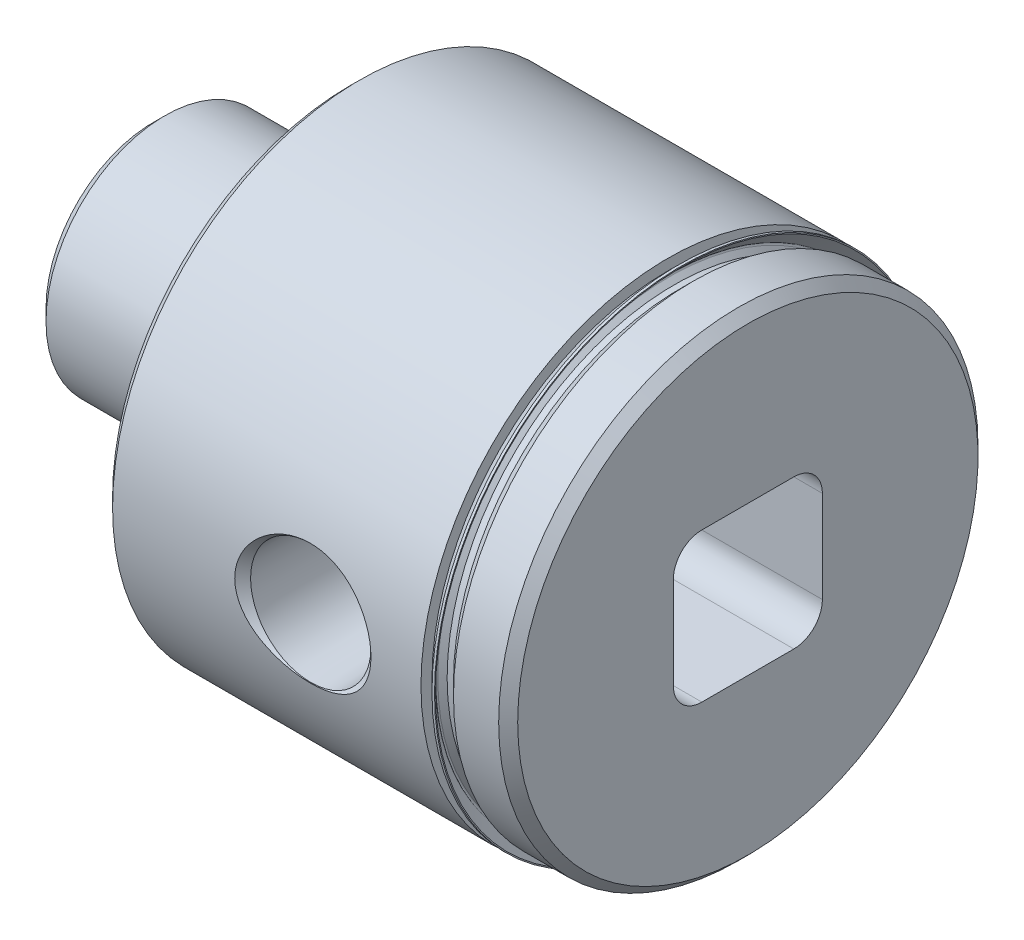
ISO-10303-21;
HEADER;
FILE_DESCRIPTION(('STEP AP214'),'2;1');
FILE_NAME('part.step','',(''),(''),'','','');
FILE_SCHEMA(('AUTOMOTIVE_DESIGN { 1 0 10303 214 1 1 1 1 }'));
ENDSEC;
DATA;
#1=APPLICATION_CONTEXT('core data for automotive mechanical design processes');
#2=APPLICATION_PROTOCOL_DEFINITION('international standard','automotive_design',2000,#1);
#3=PRODUCT_CONTEXT('',#1,'mechanical');
#4=PRODUCT('Part','Part','',(#3));
#5=PRODUCT_RELATED_PRODUCT_CATEGORY('part','',(#4));
#6=PRODUCT_DEFINITION_FORMATION('','',#4);
#7=PRODUCT_DEFINITION_CONTEXT('part definition',#1,'design');
#8=PRODUCT_DEFINITION('design','',#6,#7);
#9=PRODUCT_DEFINITION_SHAPE('','',#8);
#10=(LENGTH_UNIT() NAMED_UNIT(*) SI_UNIT(.MILLI.,.METRE.));
#11=(NAMED_UNIT(*) PLANE_ANGLE_UNIT() SI_UNIT($,.RADIAN.));
#12=(NAMED_UNIT(*) SI_UNIT($,.STERADIAN.) SOLID_ANGLE_UNIT());
#13=UNCERTAINTY_MEASURE_WITH_UNIT(LENGTH_MEASURE(1.E-05),#10,'distance_accuracy_value','');
#14=(GEOMETRIC_REPRESENTATION_CONTEXT(3) GLOBAL_UNCERTAINTY_ASSIGNED_CONTEXT((#13)) GLOBAL_UNIT_ASSIGNED_CONTEXT((#10,
#11,#12)) REPRESENTATION_CONTEXT('',''));
#15=CARTESIAN_POINT('',(0.,0.,0.));
#16=DIRECTION('',(0.,0.,1.));
#17=DIRECTION('',(1.,0.,0.));
#18=AXIS2_PLACEMENT_3D('',#15,#16,#17);
#19=CARTESIAN_POINT('',(0.,0.,0.));
#20=DIRECTION('',(1.,0.,0.));
#21=DIRECTION('',(0.,0.,-1.));
#22=AXIS2_PLACEMENT_3D('',#19,#20,#21);
#23=PLANE('',#22);
#24=CARTESIAN_POINT('',(0.,0.,0.));
#25=DIRECTION('',(-1.,0.,0.));
#26=DIRECTION('',(0.,0.,1.));
#27=AXIS2_PLACEMENT_3D('',#24,#25,#26);
#28=CIRCLE('',#27,8.58901);
#29=CARTESIAN_POINT('',(0.,0.,8.58901));
#30=VERTEX_POINT('',#29);
#31=EDGE_CURVE('E201',#30,#30,#28,.T.);
#32=ORIENTED_EDGE('',*,*,#31,.T.);
#33=EDGE_LOOP('',(#32));
#34=FACE_BOUND('',#33,.T.);
#35=CARTESIAN_POINT('',(0.,3.68299999999984,3.68299999999984));
#36=DIRECTION('',(1.,0.,0.));
#37=DIRECTION('',(0.,0.,-1.));
#38=AXIS2_PLACEMENT_3D('',#35,#36,#37);
#39=CIRCLE('',#38,2.28600000000016);
#40=CARTESIAN_POINT('',(0.,5.969,3.683));
#41=VERTEX_POINT('',#40);
#42=CARTESIAN_POINT('',(0.,3.683,5.969));
#43=VERTEX_POINT('',#42);
#44=EDGE_CURVE('E55',#41,#43,#39,.T.);
#45=ORIENTED_EDGE('',*,*,#44,.T.);
#46=DIRECTION('',(0.,-1.,0.));
#47=VECTOR('',#46,1.);
#48=CARTESIAN_POINT('',(0.,3.683,5.969));
#49=LINE('',#48,#47);
#50=CARTESIAN_POINT('',(0.,-3.683,5.969));
#51=VERTEX_POINT('',#50);
#52=EDGE_CURVE('E113',#43,#51,#49,.T.);
#53=ORIENTED_EDGE('',*,*,#52,.T.);
#54=CARTESIAN_POINT('',(0.,-3.68299999999984,3.68299999999984));
#55=DIRECTION('',(1.,0.,0.));
#56=DIRECTION('',(0.,0.,-1.));
#57=AXIS2_PLACEMENT_3D('',#54,#55,#56);
#58=CIRCLE('',#57,2.28600000000016);
#59=CARTESIAN_POINT('',(0.,-5.969,3.683));
#60=VERTEX_POINT('',#59);
#61=EDGE_CURVE('E119',#51,#60,#58,.T.);
#62=ORIENTED_EDGE('',*,*,#61,.T.);
#63=DIRECTION('',(0.,0.,-1.));
#64=VECTOR('',#63,1.);
#65=CARTESIAN_POINT('',(0.,-5.969,3.683));
#66=LINE('',#65,#64);
#67=CARTESIAN_POINT('',(0.,-5.969,-3.683));
#68=VERTEX_POINT('',#67);
#69=EDGE_CURVE('E127',#60,#68,#66,.T.);
#70=ORIENTED_EDGE('',*,*,#69,.T.);
#71=CARTESIAN_POINT('',(0.,-3.68299999999984,-3.68299999999984));
#72=DIRECTION('',(1.,0.,0.));
#73=DIRECTION('',(0.,0.,-1.));
#74=AXIS2_PLACEMENT_3D('',#71,#72,#73);
#75=CIRCLE('',#74,2.28600000000016);
#76=CARTESIAN_POINT('',(0.,-3.683,-5.969));
#77=VERTEX_POINT('',#76);
#78=EDGE_CURVE('E130',#68,#77,#75,.T.);
#79=ORIENTED_EDGE('',*,*,#78,.T.);
#80=DIRECTION('',(0.,1.,0.));
#81=VECTOR('',#80,1.);
#82=CARTESIAN_POINT('',(0.,-3.683,-5.969));
#83=LINE('',#82,#81);
#84=CARTESIAN_POINT('',(0.,3.683,-5.969));
#85=VERTEX_POINT('',#84);
#86=EDGE_CURVE('E133',#77,#85,#83,.T.);
#87=ORIENTED_EDGE('',*,*,#86,.T.);
#88=CARTESIAN_POINT('',(0.,3.68299999999984,-3.68299999999984));
#89=DIRECTION('',(1.,0.,0.));
#90=DIRECTION('',(0.,0.,-1.));
#91=AXIS2_PLACEMENT_3D('',#88,#89,#90);
#92=CIRCLE('',#91,2.28600000000016);
#93=CARTESIAN_POINT('',(0.,5.969,-3.683));
#94=VERTEX_POINT('',#93);
#95=EDGE_CURVE('E136',#85,#94,#92,.T.);
#96=ORIENTED_EDGE('',*,*,#95,.T.);
#97=DIRECTION('',(0.,0.,1.));
#98=VECTOR('',#97,1.);
#99=CARTESIAN_POINT('',(0.,5.969,-3.683));
#100=LINE('',#99,#98);
#101=EDGE_CURVE('E123',#94,#41,#100,.T.);
#102=ORIENTED_EDGE('',*,*,#101,.T.);
#103=EDGE_LOOP('',(#45,#53,#62,#70,#79,#87,#96,#102));
#104=FACE_BOUND('',#103,.T.);
#105=ADVANCED_FACE('F40',(#34,#104),#23,.F.);
#106=CARTESIAN_POINT('',(31.75,0.,19.76755));
#107=DIRECTION('',(0.,0.,-1.));
#108=DIRECTION('',(-1.,0.,0.));
#109=AXIS2_PLACEMENT_3D('',#106,#107,#108);
#110=CYLINDRICAL_SURFACE('',#109,3.175);
#111=CARTESIAN_POINT('',(31.75,0.,8.3308509257342));
#112=DIRECTION('',(0.,0.,-1.));
#113=DIRECTION('',(-1.,0.,0.));
#114=AXIS2_PLACEMENT_3D('',#111,#112,#113);
#115=CIRCLE('',#114,3.175);
#116=CARTESIAN_POINT('',(28.575,0.,8.3308509257342));
#117=VERTEX_POINT('',#116);
#118=EDGE_CURVE('E174',#117,#117,#115,.T.);
#119=ORIENTED_EDGE('',*,*,#118,.F.);
#120=EDGE_LOOP('',(#119));
#121=FACE_BOUND('',#120,.T.);
#122=CARTESIAN_POINT('',(31.75,0.,5.969));
#123=DIRECTION('',(0.,0.,-1.));
#124=DIRECTION('',(-1.,0.,0.));
#125=AXIS2_PLACEMENT_3D('',#122,#123,#124);
#126=CIRCLE('',#125,3.175);
#127=CARTESIAN_POINT('',(28.575,0.,5.969));
#128=VERTEX_POINT('',#127);
#129=EDGE_CURVE('E109',#128,#128,#126,.T.);
#130=ORIENTED_EDGE('',*,*,#129,.T.);
#131=EDGE_LOOP('',(#130));
#132=FACE_BOUND('',#131,.T.);
#133=ADVANCED_FACE('F255',(#121,#132),#110,.F.);
#134=CARTESIAN_POINT('',(47.625,18.43405,0.));
#135=DIRECTION('',(-1.,0.,0.));
#136=DIRECTION('',(0.,0.,1.));
#137=AXIS2_PLACEMENT_3D('',#134,#135,#136);
#138=PLANE('',#137);
#139=CARTESIAN_POINT('',(47.625,0.,0.));
#140=DIRECTION('',(-1.,0.,0.));
#141=DIRECTION('',(0.,0.,1.));
#142=AXIS2_PLACEMENT_3D('',#139,#140,#141);
#143=CIRCLE('',#142,18.43405);
#144=CARTESIAN_POINT('',(47.625,0.,18.43405));
#145=VERTEX_POINT('',#144);
#146=EDGE_CURVE('E177',#145,#145,#143,.T.);
#147=ORIENTED_EDGE('',*,*,#146,.F.);
#148=EDGE_LOOP('',(#147));
#149=FACE_BOUND('',#148,.T.);
#150=CARTESIAN_POINT('',(47.625,3.68299999999984,3.68299999999984));
#151=DIRECTION('',(-1.,0.,0.));
#152=DIRECTION('',(0.,0.,1.));
#153=AXIS2_PLACEMENT_3D('',#150,#151,#152);
#154=CIRCLE('',#153,2.28600000000016);
#155=CARTESIAN_POINT('',(47.625,5.969,3.683));
#156=VERTEX_POINT('',#155);
#157=CARTESIAN_POINT('',(47.625,3.683,5.969));
#158=VERTEX_POINT('',#157);
#159=EDGE_CURVE('E11',#156,#158,#154,.F.);
#160=ORIENTED_EDGE('',*,*,#159,.F.);
#161=DIRECTION('',(0.,0.,1.));
#162=VECTOR('',#161,1.);
#163=CARTESIAN_POINT('',(47.625,5.969,0.));
#164=LINE('',#163,#162);
#165=CARTESIAN_POINT('',(47.625,5.969,-3.683));
#166=VERTEX_POINT('',#165);
#167=EDGE_CURVE('E680',#166,#156,#164,.T.);
#168=ORIENTED_EDGE('',*,*,#167,.F.);
#169=CARTESIAN_POINT('',(47.625,3.68299999999984,-3.68299999999984));
#170=DIRECTION('',(-1.,0.,0.));
#171=DIRECTION('',(0.,0.,1.));
#172=AXIS2_PLACEMENT_3D('',#169,#170,#171);
#173=CIRCLE('',#172,2.28600000000016);
#174=CARTESIAN_POINT('',(47.625,3.683,-5.969));
#175=VERTEX_POINT('',#174);
#176=EDGE_CURVE('E683',#175,#166,#173,.F.);
#177=ORIENTED_EDGE('',*,*,#176,.F.);
#178=DIRECTION('',(0.,1.,0.));
#179=VECTOR('',#178,1.);
#180=CARTESIAN_POINT('',(47.625,18.43405,-5.969));
#181=LINE('',#180,#179);
#182=CARTESIAN_POINT('',(47.625,-3.683,-5.969));
#183=VERTEX_POINT('',#182);
#184=EDGE_CURVE('E695',#183,#175,#181,.T.);
#185=ORIENTED_EDGE('',*,*,#184,.F.);
#186=CARTESIAN_POINT('',(47.625,-3.68299999999984,-3.68299999999984));
#187=DIRECTION('',(-1.,0.,0.));
#188=DIRECTION('',(0.,0.,1.));
#189=AXIS2_PLACEMENT_3D('',#186,#187,#188);
#190=CIRCLE('',#189,2.28600000000016);
#191=CARTESIAN_POINT('',(47.625,-5.969,-3.683));
#192=VERTEX_POINT('',#191);
#193=EDGE_CURVE('E693',#192,#183,#190,.F.);
#194=ORIENTED_EDGE('',*,*,#193,.F.);
#195=DIRECTION('',(0.,0.,-1.));
#196=VECTOR('',#195,1.);
#197=CARTESIAN_POINT('',(47.625,-5.969,0.));
#198=LINE('',#197,#196);
#199=CARTESIAN_POINT('',(47.625,-5.969,3.683));
#200=VERTEX_POINT('',#199);
#201=EDGE_CURVE('E689',#200,#192,#198,.T.);
#202=ORIENTED_EDGE('',*,*,#201,.F.);
#203=CARTESIAN_POINT('',(47.625,-3.68299999999984,3.68299999999984));
#204=DIRECTION('',(-1.,0.,0.));
#205=DIRECTION('',(0.,0.,1.));
#206=AXIS2_PLACEMENT_3D('',#203,#204,#205);
#207=CIRCLE('',#206,2.28600000000016);
#208=CARTESIAN_POINT('',(47.625,-3.683,5.969));
#209=VERTEX_POINT('',#208);
#210=EDGE_CURVE('E688',#209,#200,#207,.F.);
#211=ORIENTED_EDGE('',*,*,#210,.F.);
#212=DIRECTION('',(0.,-1.,0.));
#213=VECTOR('',#212,1.);
#214=CARTESIAN_POINT('',(47.625,18.43405,5.969));
#215=LINE('',#214,#213);
#216=EDGE_CURVE('E48',#158,#209,#215,.T.);
#217=ORIENTED_EDGE('',*,*,#216,.F.);
#218=EDGE_LOOP('',(#160,#168,#177,#185,#194,#202,#211,#217));
#219=FACE_BOUND('',#218,.T.);
#220=ADVANCED_FACE('F258',(#149,#219),#138,.F.);
#221=CARTESIAN_POINT('',(41.2115,19.76755,0.));
#222=DIRECTION('',(-1.,0.,0.));
#223=DIRECTION('',(0.,0.,1.));
#224=AXIS2_PLACEMENT_3D('',#221,#222,#223);
#225=PLANE('',#224);
#226=CARTESIAN_POINT('',(41.2115,0.,0.));
#227=DIRECTION('',(-1.,0.,0.));
#228=DIRECTION('',(0.,0.,1.));
#229=AXIS2_PLACEMENT_3D('',#226,#227,#228);
#230=CIRCLE('',#229,19.76755);
#231=CARTESIAN_POINT('',(41.2115,0.,19.76755));
#232=VERTEX_POINT('',#231);
#233=EDGE_CURVE('E189',#232,#232,#230,.T.);
#234=ORIENTED_EDGE('',*,*,#233,.F.);
#235=EDGE_LOOP('',(#234));
#236=FACE_BOUND('',#235,.T.);
#237=CARTESIAN_POINT('',(41.2115,0.,0.));
#238=DIRECTION('',(-1.,0.,0.));
#239=DIRECTION('',(0.,0.,1.));
#240=AXIS2_PLACEMENT_3D('',#237,#238,#239);
#241=CIRCLE('',#240,18.888259175245);
#242=CARTESIAN_POINT('',(41.2115,0.,18.888259175245));
#243=VERTEX_POINT('',#242);
#244=EDGE_CURVE('E684',#243,#243,#241,.F.);
#245=ORIENTED_EDGE('',*,*,#244,.F.);
#246=EDGE_LOOP('',(#245));
#247=FACE_BOUND('',#246,.T.);
#248=ADVANCED_FACE('F262',(#236,#247),#225,.F.);
#249=CARTESIAN_POINT('',(47.625,0.,0.));
#250=DIRECTION('',(-1.,0.,0.));
#251=DIRECTION('',(0.,0.,1.));
#252=AXIS2_PLACEMENT_3D('',#249,#250,#251);
#253=CYLINDRICAL_SURFACE('',#252,19.76755);
#254=CARTESIAN_POINT('',(16.51,0.,0.));
#255=DIRECTION('',(-1.,0.,0.));
#256=DIRECTION('',(0.,0.,1.));
#257=AXIS2_PLACEMENT_3D('',#254,#255,#256);
#258=CIRCLE('',#257,19.76755);
#259=CARTESIAN_POINT('',(16.51,0.,19.76755));
#260=VERTEX_POINT('',#259);
#261=EDGE_CURVE('E192',#260,#260,#258,.T.);
#262=ORIENTED_EDGE('',*,*,#261,.F.);
#263=EDGE_LOOP('',(#262));
#264=FACE_BOUND('',#263,.T.);
#265=ORIENTED_EDGE('',*,*,#233,.T.);
#266=EDGE_LOOP('',(#265));
#267=FACE_BOUND('',#266,.T.);
#268=CARTESIAN_POINT('',(28.0621647765276,-3.56645171001473,19.4431595992687));
#269=CARTESIAN_POINT('',(28.3034227807219,-3.7638255387725,19.4069576975588));
#270=CARTESIAN_POINT('',(28.5623309553769,-3.94016323565768,19.3715185655114));
#271=CARTESIAN_POINT('',(29.106596555371,-4.24787278029809,19.3063846696766));
#272=CARTESIAN_POINT('',(29.3920019841216,-4.3791609121415,19.2767006446753));
#273=CARTESIAN_POINT('',(29.9820071757778,-4.59509779678872,19.2263747275949));
#274=CARTESIAN_POINT('',(30.2866794292612,-4.67955710237012,19.2057696325378));
#275=CARTESIAN_POINT('',(30.905863565497,-4.79973110944294,19.1760910180489));
#276=CARTESIAN_POINT('',(31.2203714914687,-4.83546516095738,19.167012921055));
#277=CARTESIAN_POINT('',(31.8650796843586,-4.85819323220641,19.161268076107));
#278=CARTESIAN_POINT('',(32.1953648176798,-4.84298785768908,19.1651613495261));
#279=CARTESIAN_POINT('',(32.8487503680904,-4.75918195043114,19.1861419785606));
#280=CARTESIAN_POINT('',(33.1718487974919,-4.69056683002416,19.2032329388161));
#281=CARTESIAN_POINT('',(33.8026427247266,-4.50071405121191,19.2486134091167));
#282=CARTESIAN_POINT('',(34.1102812323984,-4.37929564882177,19.2769413534785));
#283=CARTESIAN_POINT('',(34.6995623702994,-4.08563895581903,19.3413058120148));
#284=CARTESIAN_POINT('',(34.9812022071553,-3.91339521270716,19.3773431531325));
#285=CARTESIAN_POINT('',(35.5006560824385,-3.52663541060896,19.4513848486353));
#286=CARTESIAN_POINT('',(35.7395186805735,-3.31351781411043,19.4892996948607));
#287=CARTESIAN_POINT('',(36.1731728314553,-2.84600441757951,19.5630295327933));
#288=CARTESIAN_POINT('',(36.3679965933684,-2.59163902077584,19.5988460448858));
#289=CARTESIAN_POINT('',(36.686538904,-2.07449390956124,19.6599380331672));
#290=CARTESIAN_POINT('',(36.8153505739116,-1.81497447153852,19.6859021100914));
#291=CARTESIAN_POINT('',(36.9693914940662,-1.4106303023595,19.7176207484786));
#292=CARTESIAN_POINT('',(37.0142100576124,-1.27333221589714,19.7269892813154));
#293=CARTESIAN_POINT('',(37.0901389595911,-0.994853334857028,19.742992556994));
#294=CARTESIAN_POINT('',(37.1212512817009,-0.853673105278496,19.7496276954256));
#295=CARTESIAN_POINT('',(37.1867580476174,-0.463841558153068,19.7636487691392));
#296=CARTESIAN_POINT('',(37.2067483262046,-0.2124889915453,19.7680001913194));
#297=CARTESIAN_POINT('',(37.2022317154293,0.28960846895814,19.7670245909796));
#298=CARTESIAN_POINT('',(37.1777400879358,0.540353541730731,19.7617008880222));
#299=CARTESIAN_POINT('',(37.0885993596323,1.01844302834037,19.7426595968894));
#300=CARTESIAN_POINT('',(37.0264708090036,1.24628517044558,19.7294696135882));
#301=CARTESIAN_POINT('',(36.8672706149329,1.68884238989576,19.6965263566318));
#302=CARTESIAN_POINT('',(36.770194030156,1.903555605905,19.676772154886));
#303=CARTESIAN_POINT('',(36.5393629624218,2.32581362063585,19.6314544849768));
#304=CARTESIAN_POINT('',(36.4040081435989,2.53245348119671,19.6056486414989));
#305=CARTESIAN_POINT('',(36.1040474284322,2.9228150216871,19.5512687249584));
#306=CARTESIAN_POINT('',(35.9394294197302,3.10652715777826,19.5226935078575));
#307=CARTESIAN_POINT('',(35.5652253646671,3.46845045544958,19.4618446577912));
#308=CARTESIAN_POINT('',(35.3526378893636,3.6435497924149,19.4295266191188));
#309=CARTESIAN_POINT('',(34.9032878867151,3.95990350267997,19.3675303574784));
#310=CARTESIAN_POINT('',(34.6665137941605,4.10114157563128,19.3378534102005));
#311=CARTESIAN_POINT('',(34.1466964556106,4.36216159862035,19.2807542174228));
#312=CARTESIAN_POINT('',(33.8614493356941,4.47770694089377,19.253967141721));
#313=CARTESIAN_POINT('',(33.2758185707482,4.66328399286398,19.2098654388842));
#314=CARTESIAN_POINT('',(32.975430546772,4.73330245326301,19.1925535694688));
#315=CARTESIAN_POINT('',(32.3486101009269,4.82964105389311,19.1685499454754));
#316=CARTESIAN_POINT('',(32.0217011599297,4.85306282472644,19.1625636680598));
#317=CARTESIAN_POINT('',(31.3683715456606,4.84716182330062,19.1640559817553));
#318=CARTESIAN_POINT('',(31.0419509448001,4.81783188096734,19.1715364032759));
#319=CARTESIAN_POINT('',(30.3942590054788,4.70615116269027,19.1992582097509));
#320=CARTESIAN_POINT('',(30.0731175100091,4.62308682148938,19.2196712568968));
#321=CARTESIAN_POINT('',(29.4499382691916,4.40456844893321,19.2709194418203));
#322=CARTESIAN_POINT('',(29.1479038149128,4.26910542066319,19.3017563692753));
#323=CARTESIAN_POINT('',(28.576548936119,3.95010958394953,19.3695332877315));
#324=CARTESIAN_POINT('',(28.3068345876413,3.7672659143604,19.4063831867828));
#325=CARTESIAN_POINT('',(27.8052037092924,3.35556599404742,19.4817820788438));
#326=CARTESIAN_POINT('',(27.5732760234984,3.12672336852933,19.5203305660862));
#327=CARTESIAN_POINT('',(27.1727427338429,2.6454526084822,19.5911312844319));
#328=CARTESIAN_POINT('',(27.0008186577695,2.39583746716225,19.6236360012175));
#329=CARTESIAN_POINT('',(26.7082810922985,1.86737470933409,19.6809331370018));
#330=CARTESIAN_POINT('',(26.5876014899046,1.58856534053444,19.7057354820326));
#331=CARTESIAN_POINT('',(26.4174450794326,1.04907557631404,19.7412970513721));
#332=CARTESIAN_POINT('',(26.3607422846474,0.790762749066079,19.7534644586095));
#333=CARTESIAN_POINT('',(26.2956620629755,0.267893228465021,19.7674588586931));
#334=CARTESIAN_POINT('',(26.2872500049552,0.00334114626715032,19.7692932617138));
#335=CARTESIAN_POINT('',(26.3176453918238,-0.496994433506441,19.762732354863));
#336=CARTESIAN_POINT('',(26.3519527887928,-0.733079854752266,19.7553118301189));
#337=CARTESIAN_POINT('',(26.4585130223403,-1.19613809237272,19.7326895137283));
#338=CARTESIAN_POINT('',(26.5307734522474,-1.42310907542053,19.7174861649743));
#339=CARTESIAN_POINT('',(26.7109581958778,-1.86499121903551,19.6806424449135));
#340=CARTESIAN_POINT('',(26.819307092386,-2.07972134351336,19.6589257620958));
#341=CARTESIAN_POINT('',(27.0670168567127,-2.48973079662373,19.6112186119232));
#342=CARTESIAN_POINT('',(27.2063623862149,-2.68501967657777,19.5852302600078));
#343=CARTESIAN_POINT('',(27.4644135060909,-2.99646065670766,19.5395464783173));
#344=CARTESIAN_POINT('',(27.5762637932931,-3.11846508436446,19.5203772234222));
#345=CARTESIAN_POINT('',(27.8111417238184,-3.35110384342693,19.4817869463761));
#346=CARTESIAN_POINT('',(27.9341692892291,-3.46173825407706,19.4623659259809));
#347=CARTESIAN_POINT('',(28.0621647765276,-3.56645171001473,19.4431595992687));
#348=B_SPLINE_CURVE_WITH_KNOTS('',3,(#268,#269,#270,#271,#272,#273,#274,#275,#276,#277,#278,
#279,#280,#281,#282,#283,#284,#285,#286,#287,#288,#289,#290,#291,#292,#293,#294,#295,#296,#297,
#298,#299,#300,#301,#302,#303,#304,#305,#306,#307,#308,#309,#310,#311,#312,#313,#314,#315,#316,
#317,#318,#319,#320,#321,#322,#323,#324,#325,#326,#327,#328,#329,#330,#331,#332,#333,#334,#335,
#336,#337,#338,#339,#340,#341,#342,#343,#344,#345,#346,#347),.UNSPECIFIED.,.T.,.F.,(4,2,2,2,2,2,
2,2,2,2,2,2,2,2,2,2,2,2,2,2,2,2,2,2,2,2,2,2,2,2,2,2,2,2,2,2,2,2,2,4),(0.,0.940790642011345,
1.88332021183009,2.82963549475929,3.77557486254736,4.76287392087109,5.75044273230373,
6.74141890081163,7.73250141907355,8.69431801029598,9.65542885456443,10.5224705165865,
10.9560264412447,11.3895195975774,12.141720787344,12.8936639434869,13.6000905171265,
14.3066170123269,15.0487093621908,15.7911095905454,16.6196541764434,17.4485968150801,
18.3713434275553,19.294358459009,20.2731864579391,21.252147510362,22.2443831950913,
23.2367893235053,24.215500662844,25.1939225272553,26.1031414590371,27.0111837726312,
27.8009727606978,28.5901952900623,29.3028821875706,30.0157117279193,30.7372428067124,
31.4584176355388,31.9575421988581,32.4566632832433),.UNSPECIFIED.);
#349=CARTESIAN_POINT('',(28.0621647765276,-3.56645171001473,19.4431595992687));
#350=VERTEX_POINT('',#349);
#351=EDGE_CURVE('E225',#350,#350,#348,.T.);
#352=ORIENTED_EDGE('',*,*,#351,.F.);
#353=EDGE_LOOP('',(#352));
#354=FACE_BOUND('',#353,.T.);
#355=ADVANCED_FACE('F234',(#264,#267,#354),#253,.T.);
#356=CARTESIAN_POINT('',(15.748,0.,0.));
#357=DIRECTION('',(-1.,0.,0.));
#358=DIRECTION('',(0.,0.,1.));
#359=AXIS2_PLACEMENT_3D('',#356,#357,#358);
#360=CYLINDRICAL_SURFACE('',#359,9.49325);
#361=CARTESIAN_POINT('',(13.3604,0.,0.));
#362=DIRECTION('',(-1.,0.,0.));
#363=DIRECTION('',(0.,0.,1.));
#364=AXIS2_PLACEMENT_3D('',#361,#362,#363);
#365=CIRCLE('',#364,9.49325);
#366=CARTESIAN_POINT('',(13.3604,0.,9.49325));
#367=VERTEX_POINT('',#366);
#368=EDGE_CURVE('E222',#367,#367,#365,.T.);
#369=ORIENTED_EDGE('',*,*,#368,.F.);
#370=EDGE_LOOP('',(#369));
#371=FACE_BOUND('',#370,.T.);
#372=CARTESIAN_POINT('',(15.748,0.,0.));
#373=DIRECTION('',(1.,0.,0.));
#374=DIRECTION('',(0.,0.,-1.));
#375=AXIS2_PLACEMENT_3D('',#372,#373,#374);
#376=CIRCLE('',#375,9.49325);
#377=CARTESIAN_POINT('',(15.748,0.,-9.49325));
#378=VERTEX_POINT('',#377);
#379=EDGE_CURVE('E198',#378,#378,#376,.T.);
#380=ORIENTED_EDGE('',*,*,#379,.F.);
#381=EDGE_LOOP('',(#380));
#382=FACE_BOUND('',#381,.T.);
#383=ADVANCED_FACE('F42',(#371,#382),#360,.T.);
#384=CARTESIAN_POINT('',(13.3604,9.3979999999998,0.));
#385=DIRECTION('',(1.,0.,0.));
#386=DIRECTION('',(0.,0.,-1.));
#387=AXIS2_PLACEMENT_3D('',#384,#385,#386);
#388=PLANE('',#387);
#389=CARTESIAN_POINT('',(13.3604,0.,0.));
#390=DIRECTION('',(-1.,0.,0.));
#391=DIRECTION('',(0.,0.,1.));
#392=AXIS2_PLACEMENT_3D('',#389,#390,#391);
#393=CIRCLE('',#392,9.3979999999998);
#394=CARTESIAN_POINT('',(13.3604,0.,9.3979999999998));
#395=VERTEX_POINT('',#394);
#396=EDGE_CURVE('E219',#395,#395,#393,.T.);
#397=ORIENTED_EDGE('',*,*,#396,.F.);
#398=EDGE_LOOP('',(#397));
#399=FACE_BOUND('',#398,.T.);
#400=ORIENTED_EDGE('',*,*,#368,.T.);
#401=EDGE_LOOP('',(#400));
#402=FACE_BOUND('',#401,.T.);
#403=ADVANCED_FACE('F318',(#399,#402),#388,.F.);
#404=CARTESIAN_POINT('',(12.4714000000002,0.,0.));
#405=DIRECTION('',(-1.,0.,0.));
#406=DIRECTION('',(0.,0.,1.));
#407=AXIS2_PLACEMENT_3D('',#404,#405,#406);
#408=TOROIDAL_SURFACE('',#407,9.3979999999998,0.888999999999794);
#409=CARTESIAN_POINT('',(12.4714000000002,0.,0.));
#410=DIRECTION('',(-1.,0.,0.));
#411=DIRECTION('',(0.,0.,1.));
#412=AXIS2_PLACEMENT_3D('',#409,#410,#411);
#413=CIRCLE('',#412,8.509);
#414=CARTESIAN_POINT('',(12.4714000000002,0.,8.509));
#415=VERTEX_POINT('',#414);
#416=EDGE_CURVE('E216',#415,#415,#413,.T.);
#417=ORIENTED_EDGE('',*,*,#416,.F.);
#418=EDGE_LOOP('',(#417));
#419=FACE_BOUND('',#418,.T.);
#420=ORIENTED_EDGE('',*,*,#396,.T.);
#421=EDGE_LOOP('',(#420));
#422=FACE_BOUND('',#421,.T.);
#423=ADVANCED_FACE('F315',(#419,#422),#408,.F.);
#424=CARTESIAN_POINT('',(15.748,0.,0.));
#425=DIRECTION('',(-1.,0.,0.));
#426=DIRECTION('',(0.,0.,1.));
#427=AXIS2_PLACEMENT_3D('',#424,#425,#426);
#428=CYLINDRICAL_SURFACE('',#427,8.509);
#429=CARTESIAN_POINT('',(10.9093000000011,0.,0.));
#430=DIRECTION('',(-1.,0.,0.));
#431=DIRECTION('',(0.,0.,1.));
#432=AXIS2_PLACEMENT_3D('',#429,#430,#431);
#433=CIRCLE('',#432,8.509);
#434=CARTESIAN_POINT('',(10.9093000000011,0.,8.509));
#435=VERTEX_POINT('',#434);
#436=EDGE_CURVE('E213',#435,#435,#433,.T.);
#437=ORIENTED_EDGE('',*,*,#436,.F.);
#438=EDGE_LOOP('',(#437));
#439=FACE_BOUND('',#438,.T.);
#440=ORIENTED_EDGE('',*,*,#416,.T.);
#441=EDGE_LOOP('',(#440));
#442=FACE_BOUND('',#441,.T.);
#443=ADVANCED_FACE('F311',(#439,#442),#428,.T.);
#444=CARTESIAN_POINT('',(10.9093000000011,0.,0.));
#445=DIRECTION('',(-1.,0.,0.));
#446=DIRECTION('',(0.,0.,1.));
#447=AXIS2_PLACEMENT_3D('',#444,#445,#446);
#448=TOROIDAL_SURFACE('',#447,9.3980000000042,0.889000000004194);
#449=CARTESIAN_POINT('',(10.3482041175447,0.,0.));
#450=DIRECTION('',(-1.,0.,0.));
#451=DIRECTION('',(0.,0.,1.));
#452=AXIS2_PLACEMENT_3D('',#449,#450,#451);
#453=CIRCLE('',#452,8.70844042266663);
#454=CARTESIAN_POINT('',(10.3482041175447,0.,8.70844042266663));
#455=VERTEX_POINT('',#454);
#456=EDGE_CURVE('E210',#455,#455,#453,.T.);
#457=ORIENTED_EDGE('',*,*,#456,.F.);
#458=EDGE_LOOP('',(#457));
#459=FACE_BOUND('',#458,.T.);
#460=ORIENTED_EDGE('',*,*,#436,.T.);
#461=EDGE_LOOP('',(#460));
#462=FACE_BOUND('',#461,.T.);
#463=ADVANCED_FACE('F307',(#459,#462),#448,.F.);
#464=CARTESIAN_POINT('',(10.3482041175447,0.,0.));
#465=DIRECTION('',(-1.,0.,0.));
#466=DIRECTION('',(0.,0.,1.));
#467=AXIS2_PLACEMENT_3D('',#464,#465,#466);
#468=CONICAL_SURFACE('',#467,8.70844042266663,0.683040048469542);
#469=CARTESIAN_POINT('',(9.3446920715252,0.,0.));
#470=DIRECTION('',(-1.,0.,0.));
#471=DIRECTION('',(0.,0.,1.));
#472=AXIS2_PLACEMENT_3D('',#469,#470,#471);
#473=CIRCLE('',#472,9.525);
#474=CARTESIAN_POINT('',(9.3446920715252,0.,9.525));
#475=VERTEX_POINT('',#474);
#476=EDGE_CURVE('E207',#475,#475,#473,.T.);
#477=ORIENTED_EDGE('',*,*,#476,.F.);
#478=EDGE_LOOP('',(#477));
#479=FACE_BOUND('',#478,.T.);
#480=ORIENTED_EDGE('',*,*,#456,.T.);
#481=EDGE_LOOP('',(#480));
#482=FACE_BOUND('',#481,.T.);
#483=ADVANCED_FACE('F303',(#479,#482),#468,.T.);
#484=CARTESIAN_POINT('',(15.748,0.,0.));
#485=DIRECTION('',(-1.,0.,0.));
#486=DIRECTION('',(0.,0.,1.));
#487=AXIS2_PLACEMENT_3D('',#484,#485,#486);
#488=CYLINDRICAL_SURFACE('',#487,9.525);
#489=CARTESIAN_POINT('',(0.935989999999999,0.,0.));
#490=DIRECTION('',(-1.,0.,0.));
#491=DIRECTION('',(0.,0.,1.));
#492=AXIS2_PLACEMENT_3D('',#489,#490,#491);
#493=CIRCLE('',#492,9.525);
#494=CARTESIAN_POINT('',(0.935989999999999,0.,9.525));
#495=VERTEX_POINT('',#494);
#496=EDGE_CURVE('E204',#495,#495,#493,.T.);
#497=ORIENTED_EDGE('',*,*,#496,.F.);
#498=EDGE_LOOP('',(#497));
#499=FACE_BOUND('',#498,.T.);
#500=ORIENTED_EDGE('',*,*,#476,.T.);
#501=EDGE_LOOP('',(#500));
#502=FACE_BOUND('',#501,.T.);
#503=ADVANCED_FACE('F299',(#499,#502),#488,.T.);
#504=CARTESIAN_POINT('',(0.935989999999999,0.,0.));
#505=DIRECTION('',(1.,0.,0.));
#506=DIRECTION('',(0.,0.,-1.));
#507=AXIS2_PLACEMENT_3D('',#504,#505,#506);
#508=CONICAL_SURFACE('',#507,9.525,0.785398163397449);
#509=ORIENTED_EDGE('',*,*,#31,.F.);
#510=EDGE_LOOP('',(#509));
#511=FACE_BOUND('',#510,.T.);
#512=ORIENTED_EDGE('',*,*,#496,.T.);
#513=EDGE_LOOP('',(#512));
#514=FACE_BOUND('',#513,.T.);
#515=ADVANCED_FACE('F296',(#511,#514),#508,.T.);
#516=CARTESIAN_POINT('',(15.748,0.,0.));
#517=DIRECTION('',(1.,0.,0.));
#518=DIRECTION('',(0.,0.,-1.));
#519=AXIS2_PLACEMENT_3D('',#516,#517,#518);
#520=PLANE('',#519);
#521=CARTESIAN_POINT('',(15.748,0.,0.));
#522=DIRECTION('',(-1.,0.,0.));
#523=DIRECTION('',(0.,0.,1.));
#524=AXIS2_PLACEMENT_3D('',#521,#522,#523);
#525=CIRCLE('',#524,19.00555);
#526=CARTESIAN_POINT('',(15.748,0.,19.00555));
#527=VERTEX_POINT('',#526);
#528=EDGE_CURVE('E195',#527,#527,#525,.T.);
#529=ORIENTED_EDGE('',*,*,#528,.T.);
#530=EDGE_LOOP('',(#529));
#531=FACE_BOUND('',#530,.T.);
#532=ORIENTED_EDGE('',*,*,#379,.T.);
#533=EDGE_LOOP('',(#532));
#534=FACE_BOUND('',#533,.T.);
#535=ADVANCED_FACE('F295',(#531,#534),#520,.F.);
#536=CARTESIAN_POINT('',(16.51,0.,0.));
#537=DIRECTION('',(1.,0.,0.));
#538=DIRECTION('',(0.,0.,-1.));
#539=AXIS2_PLACEMENT_3D('',#536,#537,#538);
#540=CONICAL_SURFACE('',#539,19.76755,0.785398163397448);
#541=ORIENTED_EDGE('',*,*,#528,.F.);
#542=EDGE_LOOP('',(#541));
#543=FACE_BOUND('',#542,.T.);
#544=ORIENTED_EDGE('',*,*,#261,.T.);
#545=EDGE_LOOP('',(#544));
#546=FACE_BOUND('',#545,.T.);
#547=ADVANCED_FACE('F244',(#543,#546),#540,.T.);
#548=CARTESIAN_POINT('',(31.75,0.,19.76755));
#549=DIRECTION('',(0.,0.,1.));
#550=DIRECTION('',(1.,0.,0.));
#551=AXIS2_PLACEMENT_3D('',#548,#549,#550);
#552=CONICAL_SURFACE('',#551,5.45466392515,0.785398163397454);
#553=CARTESIAN_POINT('',(31.75,0.,19.132537191015));
#554=DIRECTION('',(0.,0.,-1.));
#555=DIRECTION('',(-1.,0.,0.));
#556=AXIS2_PLACEMENT_3D('',#553,#554,#555);
#557=CIRCLE('',#556,4.819651116165);
#558=CARTESIAN_POINT('',(26.930348883835,0.,19.132537191015));
#559=VERTEX_POINT('',#558);
#560=EDGE_CURVE('E168',#559,#559,#557,.T.);
#561=ORIENTED_EDGE('',*,*,#560,.T.);
#562=EDGE_LOOP('',(#561));
#563=FACE_BOUND('',#562,.T.);
#564=ORIENTED_EDGE('',*,*,#351,.T.);
#565=EDGE_LOOP('',(#564));
#566=FACE_BOUND('',#565,.T.);
#567=ADVANCED_FACE('F238',(#563,#566),#552,.F.);
#568=CARTESIAN_POINT('',(31.75,0.,9.09955));
#569=DIRECTION('',(0.,0.,1.));
#570=DIRECTION('',(1.,0.,0.));
#571=AXIS2_PLACEMENT_3D('',#568,#569,#570);
#572=CONICAL_SURFACE('',#571,4.506425852359,1.04719755119643);
#573=ORIENTED_EDGE('',*,*,#118,.T.);
#574=EDGE_LOOP('',(#573));
#575=FACE_BOUND('',#574,.T.);
#576=CARTESIAN_POINT('',(31.75,0.,9.09955));
#577=DIRECTION('',(0.,0.,-1.));
#578=DIRECTION('',(-1.,0.,0.));
#579=AXIS2_PLACEMENT_3D('',#576,#577,#578);
#580=CIRCLE('',#579,4.506425852359);
#581=CARTESIAN_POINT('',(27.243574147641,0.,9.09955));
#582=VERTEX_POINT('',#581);
#583=EDGE_CURVE('E171',#582,#582,#580,.T.);
#584=ORIENTED_EDGE('',*,*,#583,.F.);
#585=EDGE_LOOP('',(#584));
#586=FACE_BOUND('',#585,.T.);
#587=ADVANCED_FACE('F243',(#575,#586),#572,.F.);
#588=CARTESIAN_POINT('',(31.75,0.,19.132537191015));
#589=DIRECTION('',(0.,0.,1.));
#590=DIRECTION('',(1.,0.,0.));
#591=AXIS2_PLACEMENT_3D('',#588,#589,#590);
#592=CONICAL_SURFACE('',#591,4.819651116165,0.031209404998036);
#593=ORIENTED_EDGE('',*,*,#583,.T.);
#594=EDGE_LOOP('',(#593));
#595=FACE_BOUND('',#594,.T.);
#596=ORIENTED_EDGE('',*,*,#560,.F.);
#597=EDGE_LOOP('',(#596));
#598=FACE_BOUND('',#597,.T.);
#599=ADVANCED_FACE('F248',(#595,#598),#592,.F.);
#600=CARTESIAN_POINT('',(42.090790824755,0.,0.));
#601=DIRECTION('',(1.,0.,0.));
#602=DIRECTION('',(0.,0.,-1.));
#603=AXIS2_PLACEMENT_3D('',#600,#601,#602);
#604=CONICAL_SURFACE('',#603,19.76755,0.785398163397454);
#605=ORIENTED_EDGE('',*,*,#244,.T.);
#606=EDGE_LOOP('',(#605));
#607=FACE_BOUND('',#606,.T.);
#608=CARTESIAN_POINT('',(42.090790824755,0.,0.));
#609=DIRECTION('',(-1.,0.,0.));
#610=DIRECTION('',(0.,0.,1.));
#611=AXIS2_PLACEMENT_3D('',#608,#609,#610);
#612=CIRCLE('',#611,19.76755);
#613=CARTESIAN_POINT('',(42.090790824755,0.,19.76755));
#614=VERTEX_POINT('',#613);
#615=EDGE_CURVE('E165',#614,#614,#612,.T.);
#616=ORIENTED_EDGE('',*,*,#615,.T.);
#617=EDGE_LOOP('',(#616));
#618=FACE_BOUND('',#617,.T.);
#619=ADVANCED_FACE('F246',(#607,#618),#604,.T.);
#620=CARTESIAN_POINT('',(42.2275,0.,0.));
#621=DIRECTION('',(-1.,0.,0.));
#622=DIRECTION('',(0.,0.,1.));
#623=AXIS2_PLACEMENT_3D('',#620,#621,#622);
#624=CYLINDRICAL_SURFACE('',#623,19.76755);
#625=ORIENTED_EDGE('',*,*,#615,.F.);
#626=EDGE_LOOP('',(#625));
#627=FACE_BOUND('',#626,.T.);
#628=CARTESIAN_POINT('',(42.293990824755,0.,0.));
#629=DIRECTION('',(-1.,0.,0.));
#630=DIRECTION('',(0.,0.,1.));
#631=AXIS2_PLACEMENT_3D('',#628,#629,#630);
#632=CIRCLE('',#631,19.76755);
#633=CARTESIAN_POINT('',(42.293990824755,0.,19.76755));
#634=VERTEX_POINT('',#633);
#635=EDGE_CURVE('E162',#634,#634,#632,.T.);
#636=ORIENTED_EDGE('',*,*,#635,.T.);
#637=EDGE_LOOP('',(#636));
#638=FACE_BOUND('',#637,.T.);
#639=ADVANCED_FACE('F369',(#627,#638),#624,.T.);
#640=CARTESIAN_POINT('',(42.293990824755,19.683381804126,0.));
#641=DIRECTION('',(-1.,0.,0.));
#642=DIRECTION('',(0.,0.,1.));
#643=AXIS2_PLACEMENT_3D('',#640,#641,#642);
#644=PLANE('',#643);
#645=ORIENTED_EDGE('',*,*,#635,.F.);
#646=EDGE_LOOP('',(#645));
#647=FACE_BOUND('',#646,.T.);
#648=CARTESIAN_POINT('',(42.293990824755,0.,0.));
#649=DIRECTION('',(-1.,0.,0.));
#650=DIRECTION('',(0.,0.,1.));
#651=AXIS2_PLACEMENT_3D('',#648,#649,#650);
#652=CIRCLE('',#651,19.683381804126);
#653=CARTESIAN_POINT('',(42.293990824755,0.,19.683381804126));
#654=VERTEX_POINT('',#653);
#655=EDGE_CURVE('E159',#654,#654,#652,.T.);
#656=ORIENTED_EDGE('',*,*,#655,.T.);
#657=EDGE_LOOP('',(#656));
#658=FACE_BOUND('',#657,.T.);
#659=ADVANCED_FACE('F378',(#647,#658),#644,.F.);
#660=CARTESIAN_POINT('',(41.3448820715254,0.,0.));
#661=DIRECTION('',(1.,0.,0.));
#662=DIRECTION('',(0.,0.,-1.));
#663=AXIS2_PLACEMENT_3D('',#660,#661,#662);
#664=CONICAL_SURFACE('',#663,18.7342730508964,0.78539816339745);
#665=ORIENTED_EDGE('',*,*,#655,.F.);
#666=EDGE_LOOP('',(#665));
#667=FACE_BOUND('',#666,.T.);
#668=CARTESIAN_POINT('',(41.3448820715254,0.,0.));
#669=DIRECTION('',(-1.,0.,0.));
#670=DIRECTION('',(0.,0.,1.));
#671=AXIS2_PLACEMENT_3D('',#668,#669,#670);
#672=CIRCLE('',#671,18.7342730508964);
#673=CARTESIAN_POINT('',(41.3448820715254,0.,18.7342730508964));
#674=VERTEX_POINT('',#673);
#675=EDGE_CURVE('E156',#674,#674,#672,.T.);
#676=ORIENTED_EDGE('',*,*,#675,.T.);
#677=EDGE_LOOP('',(#676));
#678=FACE_BOUND('',#677,.T.);
#679=ADVANCED_FACE('F385',(#667,#678),#664,.F.);
#680=CARTESIAN_POINT('',(41.4346846327363,0.,0.));
#681=DIRECTION('',(-1.,0.,0.));
#682=DIRECTION('',(0.,0.,1.));
#683=AXIS2_PLACEMENT_3D('',#680,#681,#682);
#684=TOROIDAL_SURFACE('',#683,18.6444704896855,0.12700000000028);
#685=ORIENTED_EDGE('',*,*,#675,.F.);
#686=EDGE_LOOP('',(#685));
#687=FACE_BOUND('',#686,.T.);
#688=CARTESIAN_POINT('',(41.3448820715254,0.,0.));
#689=DIRECTION('',(-1.,0.,0.));
#690=DIRECTION('',(0.,0.,1.));
#691=AXIS2_PLACEMENT_3D('',#688,#689,#690);
#692=CIRCLE('',#691,18.5546679284746);
#693=CARTESIAN_POINT('',(41.3448820715254,0.,18.5546679284746));
#694=VERTEX_POINT('',#693);
#695=EDGE_CURVE('E153',#694,#694,#692,.T.);
#696=ORIENTED_EDGE('',*,*,#695,.T.);
#697=EDGE_LOOP('',(#696));
#698=FACE_BOUND('',#697,.T.);
#699=ADVANCED_FACE('F394',(#687,#698),#684,.F.);
#700=CARTESIAN_POINT('',(41.7195,0.,0.));
#701=DIRECTION('',(-1.,0.,0.));
#702=DIRECTION('',(0.,0.,1.));
#703=AXIS2_PLACEMENT_3D('',#700,#701,#702);
#704=CONICAL_SURFACE('',#703,18.18005,0.785398163397453);
#705=ORIENTED_EDGE('',*,*,#695,.F.);
#706=EDGE_LOOP('',(#705));
#707=FACE_BOUND('',#706,.T.);
#708=CARTESIAN_POINT('',(41.7195,0.,0.));
#709=DIRECTION('',(-1.,0.,0.));
#710=DIRECTION('',(0.,0.,1.));
#711=AXIS2_PLACEMENT_3D('',#708,#709,#710);
#712=CIRCLE('',#711,18.18005);
#713=CARTESIAN_POINT('',(41.7195,0.,18.18005));
#714=VERTEX_POINT('',#713);
#715=EDGE_CURVE('E232',#714,#714,#712,.T.);
#716=ORIENTED_EDGE('',*,*,#715,.T.);
#717=EDGE_LOOP('',(#716));
#718=FACE_BOUND('',#717,.T.);
#719=ADVANCED_FACE('F268',(#707,#718),#704,.T.);
#720=CARTESIAN_POINT('',(47.625,0.,0.));
#721=DIRECTION('',(-1.,0.,0.));
#722=DIRECTION('',(0.,0.,1.));
#723=AXIS2_PLACEMENT_3D('',#720,#721,#722);
#724=CONICAL_SURFACE('',#723,18.43405,0.785398163397448);
#725=CARTESIAN_POINT('',(46.863,0.,0.));
#726=DIRECTION('',(-1.,0.,0.));
#727=DIRECTION('',(0.,0.,1.));
#728=AXIS2_PLACEMENT_3D('',#725,#726,#727);
#729=CIRCLE('',#728,19.19605);
#730=CARTESIAN_POINT('',(46.863,0.,19.19605));
#731=VERTEX_POINT('',#730);
#732=EDGE_CURVE('E180',#731,#731,#729,.T.);
#733=ORIENTED_EDGE('',*,*,#732,.F.);
#734=EDGE_LOOP('',(#733));
#735=FACE_BOUND('',#734,.T.);
#736=ORIENTED_EDGE('',*,*,#146,.T.);
#737=EDGE_LOOP('',(#736));
#738=FACE_BOUND('',#737,.T.);
#739=ADVANCED_FACE('F264',(#735,#738),#724,.T.);
#740=CARTESIAN_POINT('',(47.625,0.,0.));
#741=DIRECTION('',(-1.,0.,0.));
#742=DIRECTION('',(0.,0.,1.));
#743=AXIS2_PLACEMENT_3D('',#740,#741,#742);
#744=CYLINDRICAL_SURFACE('',#743,19.19605);
#745=CARTESIAN_POINT('',(43.2435,0.,0.));
#746=DIRECTION('',(-1.,0.,0.));
#747=DIRECTION('',(0.,0.,1.));
#748=AXIS2_PLACEMENT_3D('',#745,#746,#747);
#749=CIRCLE('',#748,19.19605);
#750=CARTESIAN_POINT('',(43.2435,0.,19.19605));
#751=VERTEX_POINT('',#750);
#752=EDGE_CURVE('E183',#751,#751,#749,.T.);
#753=ORIENTED_EDGE('',*,*,#752,.F.);
#754=EDGE_LOOP('',(#753));
#755=FACE_BOUND('',#754,.T.);
#756=ORIENTED_EDGE('',*,*,#732,.T.);
#757=EDGE_LOOP('',(#756));
#758=FACE_BOUND('',#757,.T.);
#759=ADVANCED_FACE('F267',(#755,#758),#744,.T.);
#760=CARTESIAN_POINT('',(43.2435,0.,0.));
#761=DIRECTION('',(1.,0.,0.));
#762=DIRECTION('',(0.,0.,-1.));
#763=AXIS2_PLACEMENT_3D('',#760,#761,#762);
#764=CONICAL_SURFACE('',#763,19.19605,0.785398163397448);
#765=CARTESIAN_POINT('',(42.2275,0.,0.));
#766=DIRECTION('',(-1.,0.,0.));
#767=DIRECTION('',(0.,0.,1.));
#768=AXIS2_PLACEMENT_3D('',#765,#766,#767);
#769=CIRCLE('',#768,18.18005);
#770=CARTESIAN_POINT('',(42.2275,0.,18.18005));
#771=VERTEX_POINT('',#770);
#772=EDGE_CURVE('E186',#771,#771,#769,.T.);
#773=ORIENTED_EDGE('',*,*,#772,.F.);
#774=EDGE_LOOP('',(#773));
#775=FACE_BOUND('',#774,.T.);
#776=ORIENTED_EDGE('',*,*,#752,.T.);
#777=EDGE_LOOP('',(#776));
#778=FACE_BOUND('',#777,.T.);
#779=ADVANCED_FACE('F272',(#775,#778),#764,.T.);
#780=CARTESIAN_POINT('',(47.625,0.,0.));
#781=DIRECTION('',(-1.,0.,0.));
#782=DIRECTION('',(0.,0.,1.));
#783=AXIS2_PLACEMENT_3D('',#780,#781,#782);
#784=CYLINDRICAL_SURFACE('',#783,18.18005);
#785=ORIENTED_EDGE('',*,*,#772,.T.);
#786=EDGE_LOOP('',(#785));
#787=FACE_BOUND('',#786,.T.);
#788=ORIENTED_EDGE('',*,*,#715,.F.);
#789=EDGE_LOOP('',(#788));
#790=FACE_BOUND('',#789,.T.);
#791=ADVANCED_FACE('F276',(#787,#790),#784,.T.);
#792=CARTESIAN_POINT('',(95.25,3.68299999999984,3.68299999999984));
#793=DIRECTION('',(-1.,0.,0.));
#794=DIRECTION('',(0.,0.,1.));
#795=AXIS2_PLACEMENT_3D('',#792,#793,#794);
#796=CYLINDRICAL_SURFACE('',#795,2.28600000000016);
#797=ORIENTED_EDGE('',*,*,#159,.T.);
#798=DIRECTION('',(-1.,0.,0.));
#799=VECTOR('',#798,1.);
#800=CARTESIAN_POINT('',(95.25,3.683,5.969));
#801=LINE('',#800,#799);
#802=EDGE_CURVE('E103',#158,#43,#801,.T.);
#803=ORIENTED_EDGE('',*,*,#802,.T.);
#804=ORIENTED_EDGE('',*,*,#44,.F.);
#805=DIRECTION('',(-1.,0.,0.));
#806=VECTOR('',#805,1.);
#807=CARTESIAN_POINT('',(95.25,5.969,3.683));
#808=LINE('',#807,#806);
#809=EDGE_CURVE('E139',#156,#41,#808,.T.);
#810=ORIENTED_EDGE('',*,*,#809,.F.);
#811=EDGE_LOOP('',(#797,#803,#804,#810));
#812=FACE_BOUND('',#811,.T.);
#813=ADVANCED_FACE('F105',(#812),#796,.F.);
#814=CARTESIAN_POINT('',(95.25,3.683,5.969));
#815=DIRECTION('',(0.,0.,-1.));
#816=DIRECTION('',(-1.,0.,0.));
#817=AXIS2_PLACEMENT_3D('',#814,#815,#816);
#818=PLANE('',#817);
#819=ORIENTED_EDGE('',*,*,#129,.F.);
#820=EDGE_LOOP('',(#819));
#821=FACE_BOUND('',#820,.T.);
#822=ORIENTED_EDGE('',*,*,#216,.T.);
#823=DIRECTION('',(-1.,0.,0.));
#824=VECTOR('',#823,1.);
#825=CARTESIAN_POINT('',(95.25,-3.683,5.969));
#826=LINE('',#825,#824);
#827=EDGE_CURVE('E110',#209,#51,#826,.T.);
#828=ORIENTED_EDGE('',*,*,#827,.T.);
#829=ORIENTED_EDGE('',*,*,#52,.F.);
#830=ORIENTED_EDGE('',*,*,#802,.F.);
#831=EDGE_LOOP('',(#822,#828,#829,#830));
#832=FACE_BOUND('',#831,.T.);
#833=ADVANCED_FACE('F114',(#821,#832),#818,.T.);
#834=CARTESIAN_POINT('',(95.25,-3.68299999999984,3.68299999999984));
#835=DIRECTION('',(-1.,0.,0.));
#836=DIRECTION('',(0.,0.,1.));
#837=AXIS2_PLACEMENT_3D('',#834,#835,#836);
#838=CYLINDRICAL_SURFACE('',#837,2.28600000000016);
#839=ORIENTED_EDGE('',*,*,#210,.T.);
#840=DIRECTION('',(-1.,0.,0.));
#841=VECTOR('',#840,1.);
#842=CARTESIAN_POINT('',(95.25,-5.969,3.683));
#843=LINE('',#842,#841);
#844=EDGE_CURVE('E148',#200,#60,#843,.T.);
#845=ORIENTED_EDGE('',*,*,#844,.T.);
#846=ORIENTED_EDGE('',*,*,#61,.F.);
#847=ORIENTED_EDGE('',*,*,#827,.F.);
#848=EDGE_LOOP('',(#839,#845,#846,#847));
#849=FACE_BOUND('',#848,.T.);
#850=ADVANCED_FACE('F440',(#849),#838,.F.);
#851=CARTESIAN_POINT('',(95.25,-5.969,3.683));
#852=DIRECTION('',(0.,1.,0.));
#853=DIRECTION('',(0.,0.,1.));
#854=AXIS2_PLACEMENT_3D('',#851,#852,#853);
#855=PLANE('',#854);
#856=ORIENTED_EDGE('',*,*,#201,.T.);
#857=DIRECTION('',(-1.,0.,0.));
#858=VECTOR('',#857,1.);
#859=CARTESIAN_POINT('',(95.25,-5.969,-3.683));
#860=LINE('',#859,#858);
#861=EDGE_CURVE('E146',#192,#68,#860,.T.);
#862=ORIENTED_EDGE('',*,*,#861,.T.);
#863=ORIENTED_EDGE('',*,*,#69,.F.);
#864=ORIENTED_EDGE('',*,*,#844,.F.);
#865=EDGE_LOOP('',(#856,#862,#863,#864));
#866=FACE_BOUND('',#865,.T.);
#867=ADVANCED_FACE('F448',(#866),#855,.T.);
#868=CARTESIAN_POINT('',(95.25,-3.68299999999984,-3.68299999999984));
#869=DIRECTION('',(-1.,0.,0.));
#870=DIRECTION('',(0.,0.,1.));
#871=AXIS2_PLACEMENT_3D('',#868,#869,#870);
#872=CYLINDRICAL_SURFACE('',#871,2.28600000000016);
#873=ORIENTED_EDGE('',*,*,#193,.T.);
#874=DIRECTION('',(-1.,0.,0.));
#875=VECTOR('',#874,1.);
#876=CARTESIAN_POINT('',(95.25,-3.683,-5.969));
#877=LINE('',#876,#875);
#878=EDGE_CURVE('E144',#183,#77,#877,.T.);
#879=ORIENTED_EDGE('',*,*,#878,.T.);
#880=ORIENTED_EDGE('',*,*,#78,.F.);
#881=ORIENTED_EDGE('',*,*,#861,.F.);
#882=EDGE_LOOP('',(#873,#879,#880,#881));
#883=FACE_BOUND('',#882,.T.);
#884=ADVANCED_FACE('F455',(#883),#872,.F.);
#885=CARTESIAN_POINT('',(95.25,-3.683,-5.969));
#886=DIRECTION('',(0.,0.,1.));
#887=DIRECTION('',(1.,0.,0.));
#888=AXIS2_PLACEMENT_3D('',#885,#886,#887);
#889=PLANE('',#888);
#890=ORIENTED_EDGE('',*,*,#184,.T.);
#891=DIRECTION('',(-1.,0.,0.));
#892=VECTOR('',#891,1.);
#893=CARTESIAN_POINT('',(95.25,3.683,-5.969));
#894=LINE('',#893,#892);
#895=EDGE_CURVE('E142',#175,#85,#894,.T.);
#896=ORIENTED_EDGE('',*,*,#895,.T.);
#897=ORIENTED_EDGE('',*,*,#86,.F.);
#898=ORIENTED_EDGE('',*,*,#878,.F.);
#899=EDGE_LOOP('',(#890,#896,#897,#898));
#900=FACE_BOUND('',#899,.T.);
#901=ADVANCED_FACE('F463',(#900),#889,.T.);
#902=CARTESIAN_POINT('',(95.25,3.68299999999984,-3.68299999999984));
#903=DIRECTION('',(-1.,0.,0.));
#904=DIRECTION('',(0.,0.,1.));
#905=AXIS2_PLACEMENT_3D('',#902,#903,#904);
#906=CYLINDRICAL_SURFACE('',#905,2.28600000000016);
#907=ORIENTED_EDGE('',*,*,#176,.T.);
#908=DIRECTION('',(-1.,0.,0.));
#909=VECTOR('',#908,1.);
#910=CARTESIAN_POINT('',(95.25,5.969,-3.683));
#911=LINE('',#910,#909);
#912=EDGE_CURVE('E63',#166,#94,#911,.T.);
#913=ORIENTED_EDGE('',*,*,#912,.T.);
#914=ORIENTED_EDGE('',*,*,#95,.F.);
#915=ORIENTED_EDGE('',*,*,#895,.F.);
#916=EDGE_LOOP('',(#907,#913,#914,#915));
#917=FACE_BOUND('',#916,.T.);
#918=ADVANCED_FACE('F471',(#917),#906,.F.);
#919=CARTESIAN_POINT('',(95.25,5.969,-3.683));
#920=DIRECTION('',(0.,-1.,0.));
#921=DIRECTION('',(0.,0.,-1.));
#922=AXIS2_PLACEMENT_3D('',#919,#920,#921);
#923=PLANE('',#922);
#924=ORIENTED_EDGE('',*,*,#167,.T.);
#925=ORIENTED_EDGE('',*,*,#809,.T.);
#926=ORIENTED_EDGE('',*,*,#101,.F.);
#927=ORIENTED_EDGE('',*,*,#912,.F.);
#928=EDGE_LOOP('',(#924,#925,#926,#927));
#929=FACE_BOUND('',#928,.T.);
#930=ADVANCED_FACE('F478',(#929),#923,.T.);
#931=CLOSED_SHELL('',(#105,#133,#220,#248,#355,#383,#403,#423,#443,#463,#483,#503,#515,#535,
#547,#567,#587,#599,#619,#639,#659,#679,#699,#719,#739,#759,#779,#791,#813,#833,#850,#867,#884,
#901,#918,#930));
#932=MANIFOLD_SOLID_BREP('B2',#931);
#933=ADVANCED_BREP_SHAPE_REPRESENTATION('',(#18,#932),#14);
#934=SHAPE_DEFINITION_REPRESENTATION(#9,#933);
ENDSEC;
END-ISO-10303-21;
